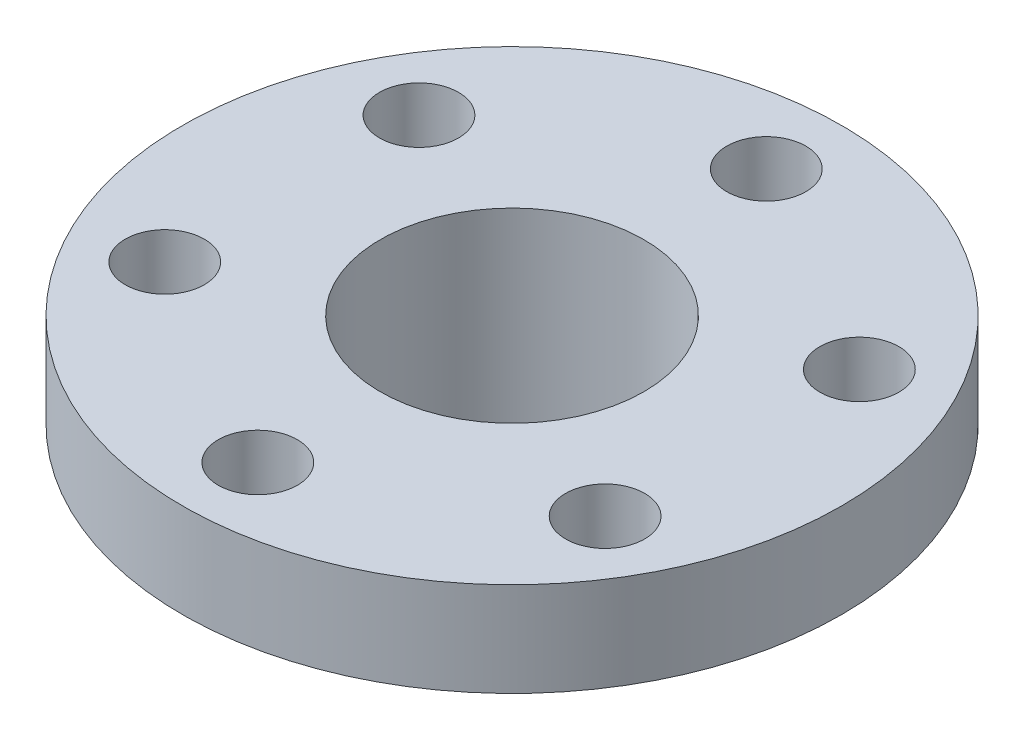
ISO-10303-21;
HEADER;
FILE_DESCRIPTION(('STEP AP214'),'2;1');
FILE_NAME('part.step','',(''),(''),'','','');
FILE_SCHEMA(('AUTOMOTIVE_DESIGN { 1 0 10303 214 1 1 1 1 }'));
ENDSEC;
DATA;
#1=APPLICATION_CONTEXT('core data for automotive mechanical design processes');
#2=APPLICATION_PROTOCOL_DEFINITION('international standard','automotive_design',2000,#1);
#3=PRODUCT_CONTEXT('',#1,'mechanical');
#4=PRODUCT('Part','Part','',(#3));
#5=PRODUCT_RELATED_PRODUCT_CATEGORY('part','',(#4));
#6=PRODUCT_DEFINITION_FORMATION('','',#4);
#7=PRODUCT_DEFINITION_CONTEXT('part definition',#1,'design');
#8=PRODUCT_DEFINITION('design','',#6,#7);
#9=PRODUCT_DEFINITION_SHAPE('','',#8);
#10=(LENGTH_UNIT() NAMED_UNIT(*) SI_UNIT(.MILLI.,.METRE.));
#11=(NAMED_UNIT(*) PLANE_ANGLE_UNIT() SI_UNIT($,.RADIAN.));
#12=(NAMED_UNIT(*) SI_UNIT($,.STERADIAN.) SOLID_ANGLE_UNIT());
#13=UNCERTAINTY_MEASURE_WITH_UNIT(LENGTH_MEASURE(1.E-05),#10,'distance_accuracy_value','');
#14=(GEOMETRIC_REPRESENTATION_CONTEXT(3) GLOBAL_UNCERTAINTY_ASSIGNED_CONTEXT((#13)) GLOBAL_UNIT_ASSIGNED_CONTEXT((#10,
#11,#12)) REPRESENTATION_CONTEXT('',''));
#15=CARTESIAN_POINT('',(0.,0.,0.));
#16=DIRECTION('',(0.,0.,1.));
#17=DIRECTION('',(1.,0.,0.));
#18=AXIS2_PLACEMENT_3D('',#15,#16,#17);
#19=CARTESIAN_POINT('',(0.,0.,0.));
#20=DIRECTION('',(0.,1.,0.));
#21=DIRECTION('',(1.,0.,0.));
#22=AXIS2_PLACEMENT_3D('',#19,#20,#21);
#23=PLANE('',#22);
#24=CARTESIAN_POINT('',(0.,0.,0.));
#25=DIRECTION('',(0.,1.,0.));
#26=DIRECTION('',(1.,0.,0.));
#27=AXIS2_PLACEMENT_3D('',#24,#25,#26);
#28=CIRCLE('',#27,9.5);
#29=CARTESIAN_POINT('',(9.5,0.,0.));
#30=VERTEX_POINT('',#29);
#31=EDGE_CURVE('E31',#30,#30,#28,.T.);
#32=ORIENTED_EDGE('',*,*,#31,.T.);
#33=EDGE_LOOP('',(#32));
#34=FACE_BOUND('',#33,.T.);
#35=CARTESIAN_POINT('',(0.,0.,0.));
#36=DIRECTION('',(0.,1.,0.));
#37=DIRECTION('',(1.,0.,0.));
#38=AXIS2_PLACEMENT_3D('',#35,#36,#37);
#39=CIRCLE('',#38,17.5);
#40=CARTESIAN_POINT('',(17.5,0.,0.));
#41=VERTEX_POINT('',#40);
#42=EDGE_CURVE('E10',#41,#41,#39,.T.);
#43=ORIENTED_EDGE('',*,*,#42,.F.);
#44=EDGE_LOOP('',(#43));
#45=FACE_BOUND('',#44,.T.);
#46=ADVANCED_FACE('F15',(#34,#45),#23,.F.);
#47=CARTESIAN_POINT('',(0.,5.,0.));
#48=DIRECTION('',(0.,1.,0.));
#49=DIRECTION('',(1.,0.,0.));
#50=AXIS2_PLACEMENT_3D('',#47,#48,#49);
#51=PLANE('',#50);
#52=CARTESIAN_POINT('',(0.,5.,13.5));
#53=DIRECTION('',(0.,-1.,0.));
#54=DIRECTION('',(0.,0.,1.));
#55=AXIS2_PLACEMENT_3D('',#52,#53,#54);
#56=CIRCLE('',#55,2.1);
#57=CARTESIAN_POINT('',(0.,5.,15.6));
#58=VERTEX_POINT('',#57);
#59=EDGE_CURVE('E48',#58,#58,#56,.T.);
#60=ORIENTED_EDGE('',*,*,#59,.T.);
#61=EDGE_LOOP('',(#60));
#62=FACE_BOUND('',#61,.T.);
#63=CARTESIAN_POINT('',(11.6913429510899,5.,6.75));
#64=DIRECTION('',(0.,-1.,0.));
#65=DIRECTION('',(0.866025403784439,0.,0.5));
#66=AXIS2_PLACEMENT_3D('',#63,#64,#65);
#67=CIRCLE('',#66,2.1);
#68=CARTESIAN_POINT('',(13.5099962990372,5.,7.8));
#69=VERTEX_POINT('',#68);
#70=EDGE_CURVE('E53',#69,#69,#67,.T.);
#71=ORIENTED_EDGE('',*,*,#70,.T.);
#72=EDGE_LOOP('',(#71));
#73=FACE_BOUND('',#72,.T.);
#74=CARTESIAN_POINT('',(11.6913429510899,5.,-6.75));
#75=DIRECTION('',(0.,-1.,0.));
#76=DIRECTION('',(0.866025403784439,0.,-0.5));
#77=AXIS2_PLACEMENT_3D('',#74,#75,#76);
#78=CIRCLE('',#77,2.1);
#79=CARTESIAN_POINT('',(13.5099962990372,5.,-7.8));
#80=VERTEX_POINT('',#79);
#81=EDGE_CURVE('E61',#80,#80,#78,.T.);
#82=ORIENTED_EDGE('',*,*,#81,.T.);
#83=EDGE_LOOP('',(#82));
#84=FACE_BOUND('',#83,.T.);
#85=CARTESIAN_POINT('',(0.,5.,-13.5));
#86=DIRECTION('',(0.,-1.,0.));
#87=DIRECTION('',(0.,0.,-1.));
#88=AXIS2_PLACEMENT_3D('',#85,#86,#87);
#89=CIRCLE('',#88,2.1);
#90=CARTESIAN_POINT('',(0.,5.,-15.6));
#91=VERTEX_POINT('',#90);
#92=EDGE_CURVE('E66',#91,#91,#89,.T.);
#93=ORIENTED_EDGE('',*,*,#92,.T.);
#94=EDGE_LOOP('',(#93));
#95=FACE_BOUND('',#94,.T.);
#96=CARTESIAN_POINT('',(-11.6913429510899,5.,-6.75));
#97=DIRECTION('',(0.,-1.,0.));
#98=DIRECTION('',(-0.866025403784438,0.,-0.5));
#99=AXIS2_PLACEMENT_3D('',#96,#97,#98);
#100=CIRCLE('',#99,2.1);
#101=CARTESIAN_POINT('',(-13.5099962990372,5.,-7.8));
#102=VERTEX_POINT('',#101);
#103=EDGE_CURVE('E71',#102,#102,#100,.T.);
#104=ORIENTED_EDGE('',*,*,#103,.T.);
#105=EDGE_LOOP('',(#104));
#106=FACE_BOUND('',#105,.T.);
#107=CARTESIAN_POINT('',(-11.6913429510899,5.,6.75));
#108=DIRECTION('',(0.,-1.,0.));
#109=DIRECTION('',(-0.866025403784439,0.,0.5));
#110=AXIS2_PLACEMENT_3D('',#107,#108,#109);
#111=CIRCLE('',#110,2.1);
#112=CARTESIAN_POINT('',(-13.5099962990372,5.,7.8));
#113=VERTEX_POINT('',#112);
#114=EDGE_CURVE('E82',#113,#113,#111,.T.);
#115=ORIENTED_EDGE('',*,*,#114,.T.);
#116=EDGE_LOOP('',(#115));
#117=FACE_BOUND('',#116,.T.);
#118=CARTESIAN_POINT('',(0.,5.,0.));
#119=DIRECTION('',(0.,-1.,0.));
#120=DIRECTION('',(1.,0.,0.));
#121=AXIS2_PLACEMENT_3D('',#118,#119,#120);
#122=CIRCLE('',#121,7.);
#123=CARTESIAN_POINT('',(7.,5.,0.));
#124=VERTEX_POINT('',#123);
#125=EDGE_CURVE('E83',#124,#124,#122,.T.);
#126=ORIENTED_EDGE('',*,*,#125,.T.);
#127=EDGE_LOOP('',(#126));
#128=FACE_BOUND('',#127,.T.);
#129=CARTESIAN_POINT('',(0.,5.,0.));
#130=DIRECTION('',(0.,1.,0.));
#131=DIRECTION('',(1.,0.,0.));
#132=AXIS2_PLACEMENT_3D('',#129,#130,#131);
#133=CIRCLE('',#132,17.5);
#134=CARTESIAN_POINT('',(17.5,5.,0.));
#135=VERTEX_POINT('',#134);
#136=EDGE_CURVE('E22',#135,#135,#133,.T.);
#137=ORIENTED_EDGE('',*,*,#136,.T.);
#138=EDGE_LOOP('',(#137));
#139=FACE_BOUND('',#138,.T.);
#140=ADVANCED_FACE('F119',(#62,#73,#84,#95,#106,#117,#128,#139),#51,.T.);
#141=CARTESIAN_POINT('',(0.,0.,0.));
#142=DIRECTION('',(0.,1.,0.));
#143=DIRECTION('',(1.,0.,0.));
#144=AXIS2_PLACEMENT_3D('',#141,#142,#143);
#145=CYLINDRICAL_SURFACE('',#144,17.5);
#146=ORIENTED_EDGE('',*,*,#42,.T.);
#147=EDGE_LOOP('',(#146));
#148=FACE_BOUND('',#147,.T.);
#149=ORIENTED_EDGE('',*,*,#136,.F.);
#150=EDGE_LOOP('',(#149));
#151=FACE_BOUND('',#150,.T.);
#152=ADVANCED_FACE('F146',(#148,#151),#145,.T.);
#153=CARTESIAN_POINT('',(0.,-1.,0.));
#154=DIRECTION('',(0.,-1.,0.));
#155=DIRECTION('',(0.,0.,-1.));
#156=AXIS2_PLACEMENT_3D('',#153,#154,#155);
#157=PLANE('',#156);
#158=CARTESIAN_POINT('',(0.,-1.,0.));
#159=DIRECTION('',(0.,1.,0.));
#160=DIRECTION('',(1.,0.,0.));
#161=AXIS2_PLACEMENT_3D('',#158,#159,#160);
#162=CIRCLE('',#161,8.6);
#163=CARTESIAN_POINT('',(8.6,-1.,0.));
#164=VERTEX_POINT('',#163);
#165=EDGE_CURVE('E91',#164,#164,#162,.T.);
#166=ORIENTED_EDGE('',*,*,#165,.T.);
#167=EDGE_LOOP('',(#166));
#168=FACE_BOUND('',#167,.T.);
#169=CARTESIAN_POINT('',(0.,-1.,0.));
#170=DIRECTION('',(0.,-1.,0.));
#171=DIRECTION('',(1.,0.,0.));
#172=AXIS2_PLACEMENT_3D('',#169,#170,#171);
#173=CIRCLE('',#172,9.5);
#174=CARTESIAN_POINT('',(9.5,-1.,0.));
#175=VERTEX_POINT('',#174);
#176=EDGE_CURVE('E38',#175,#175,#173,.T.);
#177=ORIENTED_EDGE('',*,*,#176,.T.);
#178=EDGE_LOOP('',(#177));
#179=FACE_BOUND('',#178,.T.);
#180=ADVANCED_FACE('F156',(#168,#179),#157,.T.);
#181=CARTESIAN_POINT('',(0.,0.,0.));
#182=DIRECTION('',(0.,-1.,0.));
#183=DIRECTION('',(1.,0.,0.));
#184=AXIS2_PLACEMENT_3D('',#181,#182,#183);
#185=CYLINDRICAL_SURFACE('',#184,9.5);
#186=ORIENTED_EDGE('',*,*,#31,.F.);
#187=EDGE_LOOP('',(#186));
#188=FACE_BOUND('',#187,.T.);
#189=ORIENTED_EDGE('',*,*,#176,.F.);
#190=EDGE_LOOP('',(#189));
#191=FACE_BOUND('',#190,.T.);
#192=ADVANCED_FACE('F152',(#188,#191),#185,.T.);
#193=CARTESIAN_POINT('',(0.,1.,13.5));
#194=DIRECTION('',(0.,-1.,0.));
#195=DIRECTION('',(0.,0.,-1.));
#196=AXIS2_PLACEMENT_3D('',#193,#194,#195);
#197=PLANE('',#196);
#198=CARTESIAN_POINT('',(0.,1.,13.5));
#199=DIRECTION('',(0.,-1.,0.));
#200=DIRECTION('',(0.,0.,1.));
#201=AXIS2_PLACEMENT_3D('',#198,#199,#200);
#202=CIRCLE('',#201,2.1);
#203=CARTESIAN_POINT('',(0.,1.,15.6));
#204=VERTEX_POINT('',#203);
#205=EDGE_CURVE('E44',#204,#204,#202,.T.);
#206=ORIENTED_EDGE('',*,*,#205,.F.);
#207=EDGE_LOOP('',(#206));
#208=FACE_BOUND('',#207,.T.);
#209=ADVANCED_FACE('F155',(#208),#197,.F.);
#210=CARTESIAN_POINT('',(0.,3.,13.5));
#211=DIRECTION('',(0.,-1.,0.));
#212=DIRECTION('',(0.,0.,1.));
#213=AXIS2_PLACEMENT_3D('',#210,#211,#212);
#214=CYLINDRICAL_SURFACE('',#213,2.1);
#215=ORIENTED_EDGE('',*,*,#205,.T.);
#216=EDGE_LOOP('',(#215));
#217=FACE_BOUND('',#216,.T.);
#218=ORIENTED_EDGE('',*,*,#59,.F.);
#219=EDGE_LOOP('',(#218));
#220=FACE_BOUND('',#219,.T.);
#221=ADVANCED_FACE('F169',(#217,#220),#214,.F.);
#222=CARTESIAN_POINT('',(11.6913429510899,1.,6.75));
#223=DIRECTION('',(0.,-1.,0.));
#224=DIRECTION('',(0.,0.,-1.));
#225=AXIS2_PLACEMENT_3D('',#222,#223,#224);
#226=PLANE('',#225);
#227=CARTESIAN_POINT('',(11.6913429510899,1.,6.75));
#228=DIRECTION('',(0.,-1.,0.));
#229=DIRECTION('',(0.866025403784439,0.,0.5));
#230=AXIS2_PLACEMENT_3D('',#227,#228,#229);
#231=CIRCLE('',#230,2.1);
#232=CARTESIAN_POINT('',(13.5099962990372,1.,7.8));
#233=VERTEX_POINT('',#232);
#234=EDGE_CURVE('E49',#233,#233,#231,.T.);
#235=ORIENTED_EDGE('',*,*,#234,.F.);
#236=EDGE_LOOP('',(#235));
#237=FACE_BOUND('',#236,.T.);
#238=ADVANCED_FACE('F173',(#237),#226,.F.);
#239=CARTESIAN_POINT('',(11.6913429510899,3.,6.75));
#240=DIRECTION('',(0.,-1.,0.));
#241=DIRECTION('',(0.866025403784439,0.,0.5));
#242=AXIS2_PLACEMENT_3D('',#239,#240,#241);
#243=CYLINDRICAL_SURFACE('',#242,2.1);
#244=ORIENTED_EDGE('',*,*,#234,.T.);
#245=EDGE_LOOP('',(#244));
#246=FACE_BOUND('',#245,.T.);
#247=ORIENTED_EDGE('',*,*,#70,.F.);
#248=EDGE_LOOP('',(#247));
#249=FACE_BOUND('',#248,.T.);
#250=ADVANCED_FACE('F136',(#246,#249),#243,.F.);
#251=CARTESIAN_POINT('',(11.6913429510899,1.,-6.75));
#252=DIRECTION('',(0.,-1.,0.));
#253=DIRECTION('',(0.,0.,-1.));
#254=AXIS2_PLACEMENT_3D('',#251,#252,#253);
#255=PLANE('',#254);
#256=CARTESIAN_POINT('',(11.6913429510899,1.,-6.75));
#257=DIRECTION('',(0.,-1.,0.));
#258=DIRECTION('',(0.866025403784439,0.,-0.5));
#259=AXIS2_PLACEMENT_3D('',#256,#257,#258);
#260=CIRCLE('',#259,2.1);
#261=CARTESIAN_POINT('',(13.5099962990372,1.,-7.8));
#262=VERTEX_POINT('',#261);
#263=EDGE_CURVE('E57',#262,#262,#260,.T.);
#264=ORIENTED_EDGE('',*,*,#263,.F.);
#265=EDGE_LOOP('',(#264));
#266=FACE_BOUND('',#265,.T.);
#267=ADVANCED_FACE('F125',(#266),#255,.F.);
#268=CARTESIAN_POINT('',(11.6913429510899,3.,-6.75));
#269=DIRECTION('',(0.,-1.,0.));
#270=DIRECTION('',(0.866025403784439,0.,-0.5));
#271=AXIS2_PLACEMENT_3D('',#268,#269,#270);
#272=CYLINDRICAL_SURFACE('',#271,2.1);
#273=ORIENTED_EDGE('',*,*,#263,.T.);
#274=EDGE_LOOP('',(#273));
#275=FACE_BOUND('',#274,.T.);
#276=ORIENTED_EDGE('',*,*,#81,.F.);
#277=EDGE_LOOP('',(#276));
#278=FACE_BOUND('',#277,.T.);
#279=ADVANCED_FACE('F122',(#275,#278),#272,.F.);
#280=CARTESIAN_POINT('',(0.,1.,-13.5));
#281=DIRECTION('',(0.,-1.,0.));
#282=DIRECTION('',(0.,0.,-1.));
#283=AXIS2_PLACEMENT_3D('',#280,#281,#282);
#284=PLANE('',#283);
#285=CARTESIAN_POINT('',(0.,1.,-13.5));
#286=DIRECTION('',(0.,-1.,0.));
#287=DIRECTION('',(0.,0.,-1.));
#288=AXIS2_PLACEMENT_3D('',#285,#286,#287);
#289=CIRCLE('',#288,2.1);
#290=CARTESIAN_POINT('',(0.,1.,-15.6));
#291=VERTEX_POINT('',#290);
#292=EDGE_CURVE('E62',#291,#291,#289,.T.);
#293=ORIENTED_EDGE('',*,*,#292,.F.);
#294=EDGE_LOOP('',(#293));
#295=FACE_BOUND('',#294,.T.);
#296=ADVANCED_FACE('F124',(#295),#284,.F.);
#297=CARTESIAN_POINT('',(0.,3.,-13.5));
#298=DIRECTION('',(0.,-1.,0.));
#299=DIRECTION('',(0.,0.,-1.));
#300=AXIS2_PLACEMENT_3D('',#297,#298,#299);
#301=CYLINDRICAL_SURFACE('',#300,2.1);
#302=ORIENTED_EDGE('',*,*,#292,.T.);
#303=EDGE_LOOP('',(#302));
#304=FACE_BOUND('',#303,.T.);
#305=ORIENTED_EDGE('',*,*,#92,.F.);
#306=EDGE_LOOP('',(#305));
#307=FACE_BOUND('',#306,.T.);
#308=ADVANCED_FACE('F133',(#304,#307),#301,.F.);
#309=CARTESIAN_POINT('',(-11.6913429510899,1.,-6.75));
#310=DIRECTION('',(0.,-1.,0.));
#311=DIRECTION('',(0.,0.,-1.));
#312=AXIS2_PLACEMENT_3D('',#309,#310,#311);
#313=PLANE('',#312);
#314=CARTESIAN_POINT('',(-11.6913429510899,1.,-6.75));
#315=DIRECTION('',(0.,-1.,0.));
#316=DIRECTION('',(-0.866025403784438,0.,-0.5));
#317=AXIS2_PLACEMENT_3D('',#314,#315,#316);
#318=CIRCLE('',#317,2.1);
#319=CARTESIAN_POINT('',(-13.5099962990372,1.,-7.8));
#320=VERTEX_POINT('',#319);
#321=EDGE_CURVE('E69',#320,#320,#318,.T.);
#322=ORIENTED_EDGE('',*,*,#321,.F.);
#323=EDGE_LOOP('',(#322));
#324=FACE_BOUND('',#323,.T.);
#325=ADVANCED_FACE('F180',(#324),#313,.F.);
#326=CARTESIAN_POINT('',(-11.6913429510899,3.,-6.75));
#327=DIRECTION('',(0.,-1.,0.));
#328=DIRECTION('',(-0.866025403784438,0.,-0.5));
#329=AXIS2_PLACEMENT_3D('',#326,#327,#328);
#330=CYLINDRICAL_SURFACE('',#329,2.1);
#331=ORIENTED_EDGE('',*,*,#321,.T.);
#332=EDGE_LOOP('',(#331));
#333=FACE_BOUND('',#332,.T.);
#334=ORIENTED_EDGE('',*,*,#103,.F.);
#335=EDGE_LOOP('',(#334));
#336=FACE_BOUND('',#335,.T.);
#337=ADVANCED_FACE('F182',(#333,#336),#330,.F.);
#338=CARTESIAN_POINT('',(-11.6913429510899,1.,6.75));
#339=DIRECTION('',(0.,-1.,0.));
#340=DIRECTION('',(0.,0.,-1.));
#341=AXIS2_PLACEMENT_3D('',#338,#339,#340);
#342=PLANE('',#341);
#343=CARTESIAN_POINT('',(-11.6913429510899,1.,6.75));
#344=DIRECTION('',(0.,-1.,0.));
#345=DIRECTION('',(-0.866025403784439,0.,0.5));
#346=AXIS2_PLACEMENT_3D('',#343,#344,#345);
#347=CIRCLE('',#346,2.1);
#348=CARTESIAN_POINT('',(-13.5099962990372,1.,7.8));
#349=VERTEX_POINT('',#348);
#350=EDGE_CURVE('E75',#349,#349,#347,.T.);
#351=ORIENTED_EDGE('',*,*,#350,.F.);
#352=EDGE_LOOP('',(#351));
#353=FACE_BOUND('',#352,.T.);
#354=ADVANCED_FACE('F185',(#353),#342,.F.);
#355=CARTESIAN_POINT('',(-11.6913429510899,3.,6.75));
#356=DIRECTION('',(0.,-1.,0.));
#357=DIRECTION('',(-0.866025403784439,0.,0.5));
#358=AXIS2_PLACEMENT_3D('',#355,#356,#357);
#359=CYLINDRICAL_SURFACE('',#358,2.1);
#360=ORIENTED_EDGE('',*,*,#350,.T.);
#361=EDGE_LOOP('',(#360));
#362=FACE_BOUND('',#361,.T.);
#363=ORIENTED_EDGE('',*,*,#114,.F.);
#364=EDGE_LOOP('',(#363));
#365=FACE_BOUND('',#364,.T.);
#366=ADVANCED_FACE('F194',(#362,#365),#359,.F.);
#367=CARTESIAN_POINT('',(0.,-6.,0.));
#368=DIRECTION('',(0.,1.,0.));
#369=DIRECTION('',(1.,0.,0.));
#370=AXIS2_PLACEMENT_3D('',#367,#368,#369);
#371=CYLINDRICAL_SURFACE('',#370,7.);
#372=ORIENTED_EDGE('',*,*,#125,.F.);
#373=EDGE_LOOP('',(#372));
#374=FACE_BOUND('',#373,.T.);
#375=CARTESIAN_POINT('',(0.,-5.5,0.));
#376=DIRECTION('',(0.,1.,0.));
#377=DIRECTION('',(1.,0.,0.));
#378=AXIS2_PLACEMENT_3D('',#375,#376,#377);
#379=CIRCLE('',#378,7.);
#380=CARTESIAN_POINT('',(7.,-5.5,0.));
#381=VERTEX_POINT('',#380);
#382=EDGE_CURVE('E87',#381,#381,#379,.T.);
#383=ORIENTED_EDGE('',*,*,#382,.F.);
#384=EDGE_LOOP('',(#383));
#385=FACE_BOUND('',#384,.T.);
#386=ADVANCED_FACE('F197',(#374,#385),#371,.F.);
#387=CARTESIAN_POINT('',(0.,-5.75,0.));
#388=DIRECTION('',(0.,-1.,0.));
#389=DIRECTION('',(1.,0.,0.));
#390=AXIS2_PLACEMENT_3D('',#387,#388,#389);
#391=CONICAL_SURFACE('',#390,7.25,0.785398163397448);
#392=ORIENTED_EDGE('',*,*,#382,.T.);
#393=EDGE_LOOP('',(#392));
#394=FACE_BOUND('',#393,.T.);
#395=CARTESIAN_POINT('',(0.,-6.,0.));
#396=DIRECTION('',(0.,-1.,0.));
#397=DIRECTION('',(1.,0.,0.));
#398=AXIS2_PLACEMENT_3D('',#395,#396,#397);
#399=CIRCLE('',#398,7.5);
#400=CARTESIAN_POINT('',(7.5,-6.,0.));
#401=VERTEX_POINT('',#400);
#402=EDGE_CURVE('E98',#401,#401,#399,.T.);
#403=ORIENTED_EDGE('',*,*,#402,.T.);
#404=EDGE_LOOP('',(#403));
#405=FACE_BOUND('',#404,.T.);
#406=ADVANCED_FACE('F200',(#394,#405),#391,.F.);
#407=CARTESIAN_POINT('',(0.,-1.,0.));
#408=DIRECTION('',(0.,-1.,0.));
#409=DIRECTION('',(1.,0.,0.));
#410=AXIS2_PLACEMENT_3D('',#407,#408,#409);
#411=CYLINDRICAL_SURFACE('',#410,8.6);
#412=ORIENTED_EDGE('',*,*,#165,.F.);
#413=EDGE_LOOP('',(#412));
#414=FACE_BOUND('',#413,.T.);
#415=CARTESIAN_POINT('',(0.,-5.5,0.));
#416=DIRECTION('',(0.,-1.,0.));
#417=DIRECTION('',(1.,0.,0.));
#418=AXIS2_PLACEMENT_3D('',#415,#416,#417);
#419=CIRCLE('',#418,8.6);
#420=CARTESIAN_POINT('',(8.6,-5.5,0.));
#421=VERTEX_POINT('',#420);
#422=EDGE_CURVE('E103',#421,#421,#419,.T.);
#423=ORIENTED_EDGE('',*,*,#422,.F.);
#424=EDGE_LOOP('',(#423));
#425=FACE_BOUND('',#424,.T.);
#426=ADVANCED_FACE('F205',(#414,#425),#411,.T.);
#427=CARTESIAN_POINT('',(0.,-6.,0.));
#428=DIRECTION('',(0.,-1.,0.));
#429=DIRECTION('',(0.,0.,-1.));
#430=AXIS2_PLACEMENT_3D('',#427,#428,#429);
#431=PLANE('',#430);
#432=ORIENTED_EDGE('',*,*,#402,.F.);
#433=EDGE_LOOP('',(#432));
#434=FACE_BOUND('',#433,.T.);
#435=CARTESIAN_POINT('',(0.,-6.,0.));
#436=DIRECTION('',(0.,1.,0.));
#437=DIRECTION('',(1.,0.,0.));
#438=AXIS2_PLACEMENT_3D('',#435,#436,#437);
#439=CIRCLE('',#438,8.1);
#440=CARTESIAN_POINT('',(8.1,-6.,0.));
#441=VERTEX_POINT('',#440);
#442=EDGE_CURVE('E99',#441,#441,#439,.T.);
#443=ORIENTED_EDGE('',*,*,#442,.F.);
#444=EDGE_LOOP('',(#443));
#445=FACE_BOUND('',#444,.T.);
#446=ADVANCED_FACE('F207',(#434,#445),#431,.T.);
#447=CARTESIAN_POINT('',(0.,-5.75,0.));
#448=DIRECTION('',(0.,1.,0.));
#449=DIRECTION('',(1.,0.,0.));
#450=AXIS2_PLACEMENT_3D('',#447,#448,#449);
#451=CONICAL_SURFACE('',#450,8.35,0.785398163397448);
#452=ORIENTED_EDGE('',*,*,#442,.T.);
#453=EDGE_LOOP('',(#452));
#454=FACE_BOUND('',#453,.T.);
#455=ORIENTED_EDGE('',*,*,#422,.T.);
#456=EDGE_LOOP('',(#455));
#457=FACE_BOUND('',#456,.T.);
#458=ADVANCED_FACE('F219',(#454,#457),#451,.T.);
#459=CLOSED_SHELL('',(#46,#140,#152,#180,#192,#209,#221,#238,#250,#267,#279,#296,#308,#325,#337,
#354,#366,#386,#406,#426,#446,#458));
#460=MANIFOLD_SOLID_BREP('B1',#459);
#461=ADVANCED_BREP_SHAPE_REPRESENTATION('',(#18,#460),#14);
#462=SHAPE_DEFINITION_REPRESENTATION(#9,#461);
ENDSEC;
END-ISO-10303-21;
